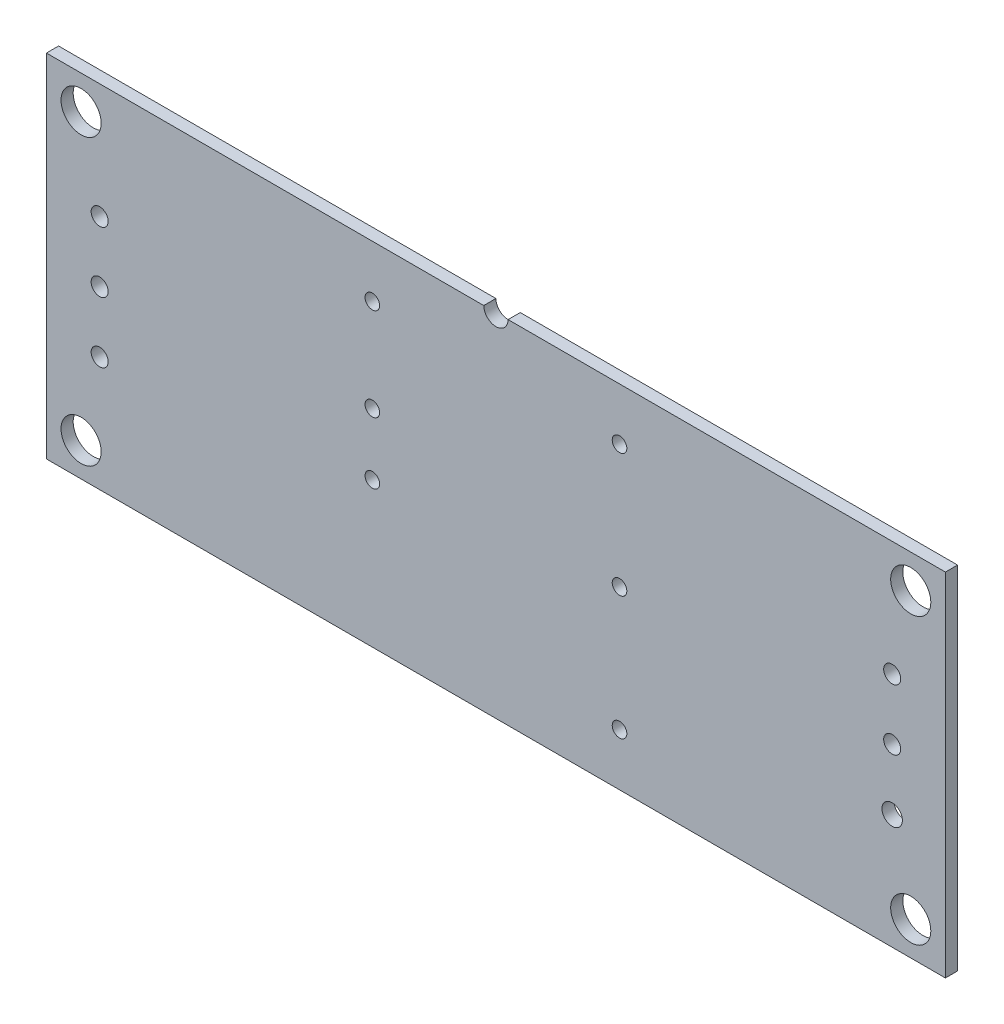
ISO-10303-21;
HEADER;
FILE_DESCRIPTION(('STEP AP214'),'2;1');
FILE_NAME('part.step','',(''),(''),'','','');
FILE_SCHEMA(('AUTOMOTIVE_DESIGN { 1 0 10303 214 1 1 1 1 }'));
ENDSEC;
DATA;
#1=APPLICATION_CONTEXT('core data for automotive mechanical design processes');
#2=APPLICATION_PROTOCOL_DEFINITION('international standard','automotive_design',2000,#1);
#3=PRODUCT_CONTEXT('',#1,'mechanical');
#4=PRODUCT('Part','Part','',(#3));
#5=PRODUCT_RELATED_PRODUCT_CATEGORY('part','',(#4));
#6=PRODUCT_DEFINITION_FORMATION('','',#4);
#7=PRODUCT_DEFINITION_CONTEXT('part definition',#1,'design');
#8=PRODUCT_DEFINITION('design','',#6,#7);
#9=PRODUCT_DEFINITION_SHAPE('','',#8);
#10=(LENGTH_UNIT() NAMED_UNIT(*) SI_UNIT(.MILLI.,.METRE.));
#11=(NAMED_UNIT(*) PLANE_ANGLE_UNIT() SI_UNIT($,.RADIAN.));
#12=(NAMED_UNIT(*) SI_UNIT($,.STERADIAN.) SOLID_ANGLE_UNIT());
#13=UNCERTAINTY_MEASURE_WITH_UNIT(LENGTH_MEASURE(1.E-05),#10,'distance_accuracy_value','');
#14=(GEOMETRIC_REPRESENTATION_CONTEXT(3) GLOBAL_UNCERTAINTY_ASSIGNED_CONTEXT((#13)) GLOBAL_UNIT_ASSIGNED_CONTEXT((#10,
#11,#12)) REPRESENTATION_CONTEXT('',''));
#15=CARTESIAN_POINT('',(0.,0.,0.));
#16=DIRECTION('',(0.,0.,1.));
#17=DIRECTION('',(1.,0.,0.));
#18=AXIS2_PLACEMENT_3D('',#15,#16,#17);
#19=CARTESIAN_POINT('',(0.,0.,0.));
#20=DIRECTION('',(0.,0.,1.));
#21=DIRECTION('',(1.,0.,0.));
#22=AXIS2_PLACEMENT_3D('',#19,#20,#21);
#23=PLANE('',#22);
#24=CARTESIAN_POINT('',(71.05,26.15,0.));
#25=DIRECTION('',(0.,0.,1.));
#26=DIRECTION('',(1.,0.,0.));
#27=AXIS2_PLACEMENT_3D('',#24,#25,#26);
#28=CIRCLE('',#27,1.65);
#29=CARTESIAN_POINT('',(72.7,26.15,0.));
#30=VERTEX_POINT('',#29);
#31=EDGE_CURVE('E173',#30,#30,#28,.T.);
#32=ORIENTED_EDGE('',*,*,#31,.T.);
#33=EDGE_LOOP('',(#32));
#34=FACE_BOUND('',#33,.T.);
#35=CARTESIAN_POINT('',(69.525,19.45,0.));
#36=DIRECTION('',(0.,0.,1.));
#37=DIRECTION('',(1.,0.,0.));
#38=AXIS2_PLACEMENT_3D('',#35,#36,#37);
#39=CIRCLE('',#38,0.699999999999992);
#40=CARTESIAN_POINT('',(70.225,19.45,0.));
#41=VERTEX_POINT('',#40);
#42=EDGE_CURVE('E186',#41,#41,#39,.T.);
#43=ORIENTED_EDGE('',*,*,#42,.T.);
#44=EDGE_LOOP('',(#43));
#45=FACE_BOUND('',#44,.T.);
#46=CARTESIAN_POINT('',(69.525,14.45,0.));
#47=DIRECTION('',(0.,0.,1.));
#48=DIRECTION('',(1.,0.,0.));
#49=AXIS2_PLACEMENT_3D('',#46,#47,#48);
#50=CIRCLE('',#49,0.699999999999992);
#51=CARTESIAN_POINT('',(70.225,14.45,0.));
#52=VERTEX_POINT('',#51);
#53=EDGE_CURVE('E263',#52,#52,#50,.T.);
#54=ORIENTED_EDGE('',*,*,#53,.T.);
#55=EDGE_LOOP('',(#54));
#56=FACE_BOUND('',#55,.T.);
#57=CARTESIAN_POINT('',(69.525,9.45,0.));
#58=DIRECTION('',(0.,0.,1.));
#59=DIRECTION('',(1.,0.,0.));
#60=AXIS2_PLACEMENT_3D('',#57,#58,#59);
#61=CIRCLE('',#60,0.838630455307604);
#62=CARTESIAN_POINT('',(70.3636304553076,9.45,0.));
#63=VERTEX_POINT('',#62);
#64=EDGE_CURVE('E244',#63,#63,#61,.T.);
#65=ORIENTED_EDGE('',*,*,#64,.T.);
#66=EDGE_LOOP('',(#65));
#67=FACE_BOUND('',#66,.T.);
#68=CARTESIAN_POINT('',(71.05,2.75,0.));
#69=DIRECTION('',(0.,0.,1.));
#70=DIRECTION('',(1.,0.,0.));
#71=AXIS2_PLACEMENT_3D('',#68,#69,#70);
#72=CIRCLE('',#71,1.65);
#73=CARTESIAN_POINT('',(72.7,2.75,0.));
#74=VERTEX_POINT('',#73);
#75=EDGE_CURVE('E245',#74,#74,#72,.T.);
#76=ORIENTED_EDGE('',*,*,#75,.T.);
#77=EDGE_LOOP('',(#76));
#78=FACE_BOUND('',#77,.T.);
#79=CARTESIAN_POINT('',(47.111,4.29,0.));
#80=DIRECTION('',(0.,0.,1.));
#81=DIRECTION('',(1.,0.,0.));
#82=AXIS2_PLACEMENT_3D('',#79,#80,#81);
#83=CIRCLE('',#82,0.6);
#84=CARTESIAN_POINT('',(47.711,4.29,0.));
#85=VERTEX_POINT('',#84);
#86=EDGE_CURVE('E190',#85,#85,#83,.T.);
#87=ORIENTED_EDGE('',*,*,#86,.T.);
#88=EDGE_LOOP('',(#87));
#89=FACE_BOUND('',#88,.T.);
#90=CARTESIAN_POINT('',(47.111,14.45,0.));
#91=DIRECTION('',(0.,0.,1.));
#92=DIRECTION('',(1.,0.,0.));
#93=AXIS2_PLACEMENT_3D('',#90,#91,#92);
#94=CIRCLE('',#93,0.6);
#95=CARTESIAN_POINT('',(47.711,14.45,0.));
#96=VERTEX_POINT('',#95);
#97=EDGE_CURVE('E291',#96,#96,#94,.T.);
#98=ORIENTED_EDGE('',*,*,#97,.T.);
#99=EDGE_LOOP('',(#98));
#100=FACE_BOUND('',#99,.T.);
#101=CARTESIAN_POINT('',(47.111,24.61,0.));
#102=DIRECTION('',(0.,0.,1.));
#103=DIRECTION('',(1.,0.,0.));
#104=AXIS2_PLACEMENT_3D('',#101,#102,#103);
#105=CIRCLE('',#104,0.6);
#106=CARTESIAN_POINT('',(47.711,24.61,0.));
#107=VERTEX_POINT('',#106);
#108=EDGE_CURVE('E231',#107,#107,#105,.T.);
#109=ORIENTED_EDGE('',*,*,#108,.T.);
#110=EDGE_LOOP('',(#109));
#111=FACE_BOUND('',#110,.T.);
#112=CARTESIAN_POINT('',(26.791,24.61,0.));
#113=DIRECTION('',(0.,0.,1.));
#114=DIRECTION('',(1.,0.,0.));
#115=AXIS2_PLACEMENT_3D('',#112,#113,#114);
#116=CIRCLE('',#115,0.6);
#117=CARTESIAN_POINT('',(27.391,24.61,0.));
#118=VERTEX_POINT('',#117);
#119=EDGE_CURVE('E232',#118,#118,#116,.T.);
#120=ORIENTED_EDGE('',*,*,#119,.T.);
#121=EDGE_LOOP('',(#120));
#122=FACE_BOUND('',#121,.T.);
#123=CARTESIAN_POINT('',(26.791,16.99,0.));
#124=DIRECTION('',(0.,0.,1.));
#125=DIRECTION('',(1.,0.,0.));
#126=AXIS2_PLACEMENT_3D('',#123,#124,#125);
#127=CIRCLE('',#126,0.6);
#128=CARTESIAN_POINT('',(27.391,16.99,0.));
#129=VERTEX_POINT('',#128);
#130=EDGE_CURVE('E237',#129,#129,#127,.T.);
#131=ORIENTED_EDGE('',*,*,#130,.T.);
#132=EDGE_LOOP('',(#131));
#133=FACE_BOUND('',#132,.T.);
#134=CARTESIAN_POINT('',(26.791,11.91,0.));
#135=DIRECTION('',(0.,0.,1.));
#136=DIRECTION('',(1.,0.,0.));
#137=AXIS2_PLACEMENT_3D('',#134,#135,#136);
#138=CIRCLE('',#137,0.6);
#139=CARTESIAN_POINT('',(27.391,11.91,0.));
#140=VERTEX_POINT('',#139);
#141=EDGE_CURVE('E200',#140,#140,#138,.T.);
#142=ORIENTED_EDGE('',*,*,#141,.T.);
#143=EDGE_LOOP('',(#142));
#144=FACE_BOUND('',#143,.T.);
#145=CARTESIAN_POINT('',(2.85,2.75,0.));
#146=DIRECTION('',(0.,0.,1.));
#147=DIRECTION('',(1.,0.,0.));
#148=AXIS2_PLACEMENT_3D('',#145,#146,#147);
#149=CIRCLE('',#148,1.65);
#150=CARTESIAN_POINT('',(4.5,2.75,0.));
#151=VERTEX_POINT('',#150);
#152=EDGE_CURVE('E201',#151,#151,#149,.T.);
#153=ORIENTED_EDGE('',*,*,#152,.T.);
#154=EDGE_LOOP('',(#153));
#155=FACE_BOUND('',#154,.T.);
#156=CARTESIAN_POINT('',(4.375,9.45,0.));
#157=DIRECTION('',(0.,0.,1.));
#158=DIRECTION('',(1.,0.,0.));
#159=AXIS2_PLACEMENT_3D('',#156,#157,#158);
#160=CIRCLE('',#159,0.7);
#161=CARTESIAN_POINT('',(5.075,9.45,0.));
#162=VERTEX_POINT('',#161);
#163=EDGE_CURVE('E240',#162,#162,#160,.T.);
#164=ORIENTED_EDGE('',*,*,#163,.T.);
#165=EDGE_LOOP('',(#164));
#166=FACE_BOUND('',#165,.T.);
#167=CARTESIAN_POINT('',(4.375,14.45,0.));
#168=DIRECTION('',(0.,0.,1.));
#169=DIRECTION('',(1.,0.,0.));
#170=AXIS2_PLACEMENT_3D('',#167,#168,#169);
#171=CIRCLE('',#170,0.7);
#172=CARTESIAN_POINT('',(5.075,14.45,0.));
#173=VERTEX_POINT('',#172);
#174=EDGE_CURVE('E287',#173,#173,#171,.T.);
#175=ORIENTED_EDGE('',*,*,#174,.T.);
#176=EDGE_LOOP('',(#175));
#177=FACE_BOUND('',#176,.T.);
#178=CARTESIAN_POINT('',(4.375,19.45,0.));
#179=DIRECTION('',(0.,0.,1.));
#180=DIRECTION('',(1.,0.,0.));
#181=AXIS2_PLACEMENT_3D('',#178,#179,#180);
#182=CIRCLE('',#181,0.7);
#183=CARTESIAN_POINT('',(5.075,19.45,0.));
#184=VERTEX_POINT('',#183);
#185=EDGE_CURVE('E208',#184,#184,#182,.T.);
#186=ORIENTED_EDGE('',*,*,#185,.T.);
#187=EDGE_LOOP('',(#186));
#188=FACE_BOUND('',#187,.T.);
#189=CARTESIAN_POINT('',(2.85,26.15,0.));
#190=DIRECTION('',(0.,0.,1.));
#191=DIRECTION('',(1.,0.,0.));
#192=AXIS2_PLACEMENT_3D('',#189,#190,#191);
#193=CIRCLE('',#192,1.65);
#194=CARTESIAN_POINT('',(4.5,26.15,0.));
#195=VERTEX_POINT('',#194);
#196=EDGE_CURVE('E284',#195,#195,#193,.T.);
#197=ORIENTED_EDGE('',*,*,#196,.T.);
#198=EDGE_LOOP('',(#197));
#199=FACE_BOUND('',#198,.T.);
#200=DIRECTION('',(1.,0.,0.));
#201=VECTOR('',#200,1.);
#202=CARTESIAN_POINT('',(73.9,28.9,0.));
#203=LINE('',#202,#201);
#204=CARTESIAN_POINT('',(37.95,28.9,0.));
#205=VERTEX_POINT('',#204);
#206=CARTESIAN_POINT('',(73.9,28.9,0.));
#207=VERTEX_POINT('',#206);
#208=EDGE_CURVE('E11',#205,#207,#203,.T.);
#209=ORIENTED_EDGE('',*,*,#208,.T.);
#210=DIRECTION('',(0.,-1.,0.));
#211=VECTOR('',#210,1.);
#212=CARTESIAN_POINT('',(73.9,0.,0.));
#213=LINE('',#212,#211);
#214=CARTESIAN_POINT('',(73.9,0.,0.));
#215=VERTEX_POINT('',#214);
#216=EDGE_CURVE('E202',#207,#215,#213,.T.);
#217=ORIENTED_EDGE('',*,*,#216,.T.);
#218=DIRECTION('',(-1.,0.,0.));
#219=VECTOR('',#218,1.);
#220=CARTESIAN_POINT('',(0.,0.,0.));
#221=LINE('',#220,#219);
#222=CARTESIAN_POINT('',(0.,0.,0.));
#223=VERTEX_POINT('',#222);
#224=EDGE_CURVE('E214',#215,#223,#221,.T.);
#225=ORIENTED_EDGE('',*,*,#224,.T.);
#226=DIRECTION('',(0.,1.,0.));
#227=VECTOR('',#226,1.);
#228=CARTESIAN_POINT('',(0.,28.9,0.));
#229=LINE('',#228,#227);
#230=CARTESIAN_POINT('',(0.,28.9,0.));
#231=VERTEX_POINT('',#230);
#232=EDGE_CURVE('E248',#223,#231,#229,.T.);
#233=ORIENTED_EDGE('',*,*,#232,.T.);
#234=DIRECTION('',(1.,0.,0.));
#235=VECTOR('',#234,1.);
#236=CARTESIAN_POINT('',(73.9,28.9,0.));
#237=LINE('',#236,#235);
#238=CARTESIAN_POINT('',(35.95,28.9,0.));
#239=VERTEX_POINT('',#238);
#240=EDGE_CURVE('E271',#231,#239,#237,.T.);
#241=ORIENTED_EDGE('',*,*,#240,.T.);
#242=CARTESIAN_POINT('',(36.95,28.9,0.));
#243=DIRECTION('',(0.,0.,1.));
#244=DIRECTION('',(1.,0.,0.));
#245=AXIS2_PLACEMENT_3D('',#242,#243,#244);
#246=CIRCLE('',#245,1.);
#247=EDGE_CURVE('E221',#239,#205,#246,.T.);
#248=ORIENTED_EDGE('',*,*,#247,.T.);
#249=EDGE_LOOP('',(#209,#217,#225,#233,#241,#248));
#250=FACE_BOUND('',#249,.T.);
#251=ADVANCED_FACE('F18',(#34,#45,#56,#67,#78,#89,#100,#111,#122,#133,#144,#155,#166,#177,#188,
#199,#250),#23,.F.);
#252=CARTESIAN_POINT('',(73.9,28.9,1.));
#253=DIRECTION('',(0.,-1.,0.));
#254=DIRECTION('',(0.,0.,-1.));
#255=AXIS2_PLACEMENT_3D('',#252,#253,#254);
#256=PLANE('',#255);
#257=DIRECTION('',(-1.,0.,0.));
#258=VECTOR('',#257,1.);
#259=CARTESIAN_POINT('',(0.,28.9,1.));
#260=LINE('',#259,#258);
#261=CARTESIAN_POINT('',(73.9,28.9,1.));
#262=VERTEX_POINT('',#261);
#263=CARTESIAN_POINT('',(37.95,28.9,1.));
#264=VERTEX_POINT('',#263);
#265=EDGE_CURVE('E191',#262,#264,#260,.T.);
#266=ORIENTED_EDGE('',*,*,#265,.F.);
#267=DIRECTION('',(0.,0.,-1.));
#268=VECTOR('',#267,1.);
#269=CARTESIAN_POINT('',(73.9,28.9,1.));
#270=LINE('',#269,#268);
#271=EDGE_CURVE('E266',#262,#207,#270,.T.);
#272=ORIENTED_EDGE('',*,*,#271,.T.);
#273=ORIENTED_EDGE('',*,*,#208,.F.);
#274=DIRECTION('',(0.,0.,1.));
#275=VECTOR('',#274,1.);
#276=CARTESIAN_POINT('',(37.95,28.9,-78.7259054511142));
#277=LINE('',#276,#275);
#278=EDGE_CURVE('E28',#205,#264,#277,.T.);
#279=ORIENTED_EDGE('',*,*,#278,.T.);
#280=EDGE_LOOP('',(#266,#272,#273,#279));
#281=FACE_BOUND('',#280,.T.);
#282=ADVANCED_FACE('F363',(#281),#256,.F.);
#283=CARTESIAN_POINT('',(36.95,28.9,-78.7259054511142));
#284=DIRECTION('',(0.,0.,1.));
#285=DIRECTION('',(1.,0.,0.));
#286=AXIS2_PLACEMENT_3D('',#283,#284,#285);
#287=CYLINDRICAL_SURFACE('',#286,1.);
#288=ORIENTED_EDGE('',*,*,#247,.F.);
#289=DIRECTION('',(0.,0.,1.));
#290=VECTOR('',#289,1.);
#291=CARTESIAN_POINT('',(35.95,28.9,1.));
#292=LINE('',#291,#290);
#293=CARTESIAN_POINT('',(35.95,28.9,1.));
#294=VERTEX_POINT('',#293);
#295=EDGE_CURVE('E267',#239,#294,#292,.T.);
#296=ORIENTED_EDGE('',*,*,#295,.T.);
#297=CARTESIAN_POINT('',(36.95,28.9,1.));
#298=DIRECTION('',(0.,0.,-1.));
#299=DIRECTION('',(1.,0.,0.));
#300=AXIS2_PLACEMENT_3D('',#297,#298,#299);
#301=CIRCLE('',#300,1.);
#302=EDGE_CURVE('E195',#264,#294,#301,.T.);
#303=ORIENTED_EDGE('',*,*,#302,.F.);
#304=ORIENTED_EDGE('',*,*,#278,.F.);
#305=EDGE_LOOP('',(#288,#296,#303,#304));
#306=FACE_BOUND('',#305,.T.);
#307=ADVANCED_FACE('F403',(#306),#287,.F.);
#308=CARTESIAN_POINT('',(73.9,28.9,1.));
#309=DIRECTION('',(0.,-1.,0.));
#310=DIRECTION('',(0.,0.,-1.));
#311=AXIS2_PLACEMENT_3D('',#308,#309,#310);
#312=PLANE('',#311);
#313=ORIENTED_EDGE('',*,*,#240,.F.);
#314=DIRECTION('',(0.,0.,1.));
#315=VECTOR('',#314,1.);
#316=CARTESIAN_POINT('',(0.,28.9,1.));
#317=LINE('',#316,#315);
#318=CARTESIAN_POINT('',(0.,28.9,1.));
#319=VERTEX_POINT('',#318);
#320=EDGE_CURVE('E218',#231,#319,#317,.T.);
#321=ORIENTED_EDGE('',*,*,#320,.T.);
#322=DIRECTION('',(-1.,0.,0.));
#323=VECTOR('',#322,1.);
#324=CARTESIAN_POINT('',(0.,28.9,1.));
#325=LINE('',#324,#323);
#326=EDGE_CURVE('E249',#294,#319,#325,.T.);
#327=ORIENTED_EDGE('',*,*,#326,.F.);
#328=ORIENTED_EDGE('',*,*,#295,.F.);
#329=EDGE_LOOP('',(#313,#321,#327,#328));
#330=FACE_BOUND('',#329,.T.);
#331=ADVANCED_FACE('F400',(#330),#312,.F.);
#332=CARTESIAN_POINT('',(0.,28.9,1.));
#333=DIRECTION('',(1.,0.,0.));
#334=DIRECTION('',(0.,1.,0.));
#335=AXIS2_PLACEMENT_3D('',#332,#333,#334);
#336=PLANE('',#335);
#337=DIRECTION('',(0.,0.,1.));
#338=VECTOR('',#337,1.);
#339=CARTESIAN_POINT('',(0.,0.,1.));
#340=LINE('',#339,#338);
#341=CARTESIAN_POINT('',(0.,0.,1.));
#342=VERTEX_POINT('',#341);
#343=EDGE_CURVE('E206',#223,#342,#340,.T.);
#344=ORIENTED_EDGE('',*,*,#343,.T.);
#345=DIRECTION('',(0.,-1.,0.));
#346=VECTOR('',#345,1.);
#347=CARTESIAN_POINT('',(0.,0.,1.));
#348=LINE('',#347,#346);
#349=EDGE_CURVE('E253',#319,#342,#348,.T.);
#350=ORIENTED_EDGE('',*,*,#349,.F.);
#351=ORIENTED_EDGE('',*,*,#320,.F.);
#352=ORIENTED_EDGE('',*,*,#232,.F.);
#353=EDGE_LOOP('',(#344,#350,#351,#352));
#354=FACE_BOUND('',#353,.T.);
#355=ADVANCED_FACE('F397',(#354),#336,.F.);
#356=CARTESIAN_POINT('',(0.,0.,1.));
#357=DIRECTION('',(0.,1.,0.));
#358=DIRECTION('',(1.,0.,0.));
#359=AXIS2_PLACEMENT_3D('',#356,#357,#358);
#360=PLANE('',#359);
#361=DIRECTION('',(0.,0.,1.));
#362=VECTOR('',#361,1.);
#363=CARTESIAN_POINT('',(73.9,0.,1.));
#364=LINE('',#363,#362);
#365=CARTESIAN_POINT('',(73.9,0.,1.));
#366=VERTEX_POINT('',#365);
#367=EDGE_CURVE('E207',#215,#366,#364,.T.);
#368=ORIENTED_EDGE('',*,*,#367,.T.);
#369=DIRECTION('',(1.,0.,0.));
#370=VECTOR('',#369,1.);
#371=CARTESIAN_POINT('',(0.,0.,1.));
#372=LINE('',#371,#370);
#373=EDGE_CURVE('E184',#342,#366,#372,.T.);
#374=ORIENTED_EDGE('',*,*,#373,.F.);
#375=ORIENTED_EDGE('',*,*,#343,.F.);
#376=ORIENTED_EDGE('',*,*,#224,.F.);
#377=EDGE_LOOP('',(#368,#374,#375,#376));
#378=FACE_BOUND('',#377,.T.);
#379=ADVANCED_FACE('F390',(#378),#360,.F.);
#380=CARTESIAN_POINT('',(73.9,0.,1.));
#381=DIRECTION('',(-1.,0.,0.));
#382=DIRECTION('',(0.,0.,1.));
#383=AXIS2_PLACEMENT_3D('',#380,#381,#382);
#384=PLANE('',#383);
#385=ORIENTED_EDGE('',*,*,#271,.F.);
#386=DIRECTION('',(0.,1.,0.));
#387=VECTOR('',#386,1.);
#388=CARTESIAN_POINT('',(73.9,0.,1.));
#389=LINE('',#388,#387);
#390=EDGE_CURVE('E196',#366,#262,#389,.T.);
#391=ORIENTED_EDGE('',*,*,#390,.F.);
#392=ORIENTED_EDGE('',*,*,#367,.F.);
#393=ORIENTED_EDGE('',*,*,#216,.F.);
#394=EDGE_LOOP('',(#385,#391,#392,#393));
#395=FACE_BOUND('',#394,.T.);
#396=ADVANCED_FACE('F380',(#395),#384,.F.);
#397=CARTESIAN_POINT('',(0.,0.,1.));
#398=DIRECTION('',(0.,0.,1.));
#399=DIRECTION('',(1.,0.,0.));
#400=AXIS2_PLACEMENT_3D('',#397,#398,#399);
#401=PLANE('',#400);
#402=CARTESIAN_POINT('',(71.05,26.15,1.));
#403=DIRECTION('',(0.,0.,-1.));
#404=DIRECTION('',(1.,0.,0.));
#405=AXIS2_PLACEMENT_3D('',#402,#403,#404);
#406=CIRCLE('',#405,1.65);
#407=CARTESIAN_POINT('',(72.7,26.15,1.));
#408=VERTEX_POINT('',#407);
#409=EDGE_CURVE('E177',#408,#408,#406,.T.);
#410=ORIENTED_EDGE('',*,*,#409,.T.);
#411=EDGE_LOOP('',(#410));
#412=FACE_BOUND('',#411,.T.);
#413=CARTESIAN_POINT('',(69.525,19.45,1.));
#414=DIRECTION('',(0.,0.,-1.));
#415=DIRECTION('',(1.,0.,0.));
#416=AXIS2_PLACEMENT_3D('',#413,#414,#415);
#417=CIRCLE('',#416,0.699999999999992);
#418=CARTESIAN_POINT('',(70.225,19.45,1.));
#419=VERTEX_POINT('',#418);
#420=EDGE_CURVE('E178',#419,#419,#417,.T.);
#421=ORIENTED_EDGE('',*,*,#420,.T.);
#422=EDGE_LOOP('',(#421));
#423=FACE_BOUND('',#422,.T.);
#424=CARTESIAN_POINT('',(69.525,14.45,1.));
#425=DIRECTION('',(0.,0.,-1.));
#426=DIRECTION('',(1.,0.,0.));
#427=AXIS2_PLACEMENT_3D('',#424,#425,#426);
#428=CIRCLE('',#427,0.699999999999992);
#429=CARTESIAN_POINT('',(70.225,14.45,1.));
#430=VERTEX_POINT('',#429);
#431=EDGE_CURVE('E226',#430,#430,#428,.T.);
#432=ORIENTED_EDGE('',*,*,#431,.T.);
#433=EDGE_LOOP('',(#432));
#434=FACE_BOUND('',#433,.T.);
#435=CARTESIAN_POINT('',(69.525,9.45,1.));
#436=DIRECTION('',(0.,0.,-1.));
#437=DIRECTION('',(1.,0.,0.));
#438=AXIS2_PLACEMENT_3D('',#435,#436,#437);
#439=CIRCLE('',#438,0.838630455307604);
#440=CARTESIAN_POINT('',(70.3636304553076,9.45,1.));
#441=VERTEX_POINT('',#440);
#442=EDGE_CURVE('E260',#441,#441,#439,.T.);
#443=ORIENTED_EDGE('',*,*,#442,.T.);
#444=EDGE_LOOP('',(#443));
#445=FACE_BOUND('',#444,.T.);
#446=CARTESIAN_POINT('',(71.05,2.75,1.));
#447=DIRECTION('',(0.,0.,-1.));
#448=DIRECTION('',(1.,0.,0.));
#449=AXIS2_PLACEMENT_3D('',#446,#447,#448);
#450=CIRCLE('',#449,1.65);
#451=CARTESIAN_POINT('',(72.7,2.75,1.));
#452=VERTEX_POINT('',#451);
#453=EDGE_CURVE('E241',#452,#452,#450,.T.);
#454=ORIENTED_EDGE('',*,*,#453,.T.);
#455=EDGE_LOOP('',(#454));
#456=FACE_BOUND('',#455,.T.);
#457=CARTESIAN_POINT('',(47.111,4.29,1.));
#458=DIRECTION('',(0.,0.,-1.));
#459=DIRECTION('',(1.,0.,0.));
#460=AXIS2_PLACEMENT_3D('',#457,#458,#459);
#461=CIRCLE('',#460,0.6);
#462=CARTESIAN_POINT('',(47.711,4.29,1.));
#463=VERTEX_POINT('',#462);
#464=EDGE_CURVE('E298',#463,#463,#461,.T.);
#465=ORIENTED_EDGE('',*,*,#464,.T.);
#466=EDGE_LOOP('',(#465));
#467=FACE_BOUND('',#466,.T.);
#468=CARTESIAN_POINT('',(47.111,14.45,1.));
#469=DIRECTION('',(0.,0.,-1.));
#470=DIRECTION('',(1.,0.,0.));
#471=AXIS2_PLACEMENT_3D('',#468,#469,#470);
#472=CIRCLE('',#471,0.6);
#473=CARTESIAN_POINT('',(47.711,14.45,1.));
#474=VERTEX_POINT('',#473);
#475=EDGE_CURVE('E295',#474,#474,#472,.T.);
#476=ORIENTED_EDGE('',*,*,#475,.T.);
#477=EDGE_LOOP('',(#476));
#478=FACE_BOUND('',#477,.T.);
#479=CARTESIAN_POINT('',(47.111,24.61,1.));
#480=DIRECTION('',(0.,0.,-1.));
#481=DIRECTION('',(1.,0.,0.));
#482=AXIS2_PLACEMENT_3D('',#479,#480,#481);
#483=CIRCLE('',#482,0.6);
#484=CARTESIAN_POINT('',(47.711,24.61,1.));
#485=VERTEX_POINT('',#484);
#486=EDGE_CURVE('E276',#485,#485,#483,.T.);
#487=ORIENTED_EDGE('',*,*,#486,.T.);
#488=EDGE_LOOP('',(#487));
#489=FACE_BOUND('',#488,.T.);
#490=CARTESIAN_POINT('',(26.791,24.61,1.));
#491=DIRECTION('',(0.,0.,-1.));
#492=DIRECTION('',(1.,0.,0.));
#493=AXIS2_PLACEMENT_3D('',#490,#491,#492);
#494=CIRCLE('',#493,0.6);
#495=CARTESIAN_POINT('',(27.391,24.61,1.));
#496=VERTEX_POINT('',#495);
#497=EDGE_CURVE('E228',#496,#496,#494,.T.);
#498=ORIENTED_EDGE('',*,*,#497,.T.);
#499=EDGE_LOOP('',(#498));
#500=FACE_BOUND('',#499,.T.);
#501=CARTESIAN_POINT('',(26.791,16.99,1.));
#502=DIRECTION('',(0.,0.,-1.));
#503=DIRECTION('',(1.,0.,0.));
#504=AXIS2_PLACEMENT_3D('',#501,#502,#503);
#505=CIRCLE('',#504,0.6);
#506=CARTESIAN_POINT('',(27.391,16.99,1.));
#507=VERTEX_POINT('',#506);
#508=EDGE_CURVE('E21',#507,#507,#505,.T.);
#509=ORIENTED_EDGE('',*,*,#508,.T.);
#510=EDGE_LOOP('',(#509));
#511=FACE_BOUND('',#510,.T.);
#512=CARTESIAN_POINT('',(26.791,11.91,1.));
#513=DIRECTION('',(0.,0.,-1.));
#514=DIRECTION('',(1.,0.,0.));
#515=AXIS2_PLACEMENT_3D('',#512,#513,#514);
#516=CIRCLE('',#515,0.6);
#517=CARTESIAN_POINT('',(27.391,11.91,1.));
#518=VERTEX_POINT('',#517);
#519=EDGE_CURVE('E233',#518,#518,#516,.T.);
#520=ORIENTED_EDGE('',*,*,#519,.T.);
#521=EDGE_LOOP('',(#520));
#522=FACE_BOUND('',#521,.T.);
#523=CARTESIAN_POINT('',(2.85,2.75,1.));
#524=DIRECTION('',(0.,0.,-1.));
#525=DIRECTION('',(1.,0.,0.));
#526=AXIS2_PLACEMENT_3D('',#523,#524,#525);
#527=CIRCLE('',#526,1.65);
#528=CARTESIAN_POINT('',(4.5,2.75,1.));
#529=VERTEX_POINT('',#528);
#530=EDGE_CURVE('E197',#529,#529,#527,.T.);
#531=ORIENTED_EDGE('',*,*,#530,.T.);
#532=EDGE_LOOP('',(#531));
#533=FACE_BOUND('',#532,.T.);
#534=CARTESIAN_POINT('',(4.375,9.45,1.));
#535=DIRECTION('',(0.,0.,-1.));
#536=DIRECTION('',(1.,0.,0.));
#537=AXIS2_PLACEMENT_3D('',#534,#535,#536);
#538=CIRCLE('',#537,0.7);
#539=CARTESIAN_POINT('',(5.075,9.45,1.));
#540=VERTEX_POINT('',#539);
#541=EDGE_CURVE('E224',#540,#540,#538,.T.);
#542=ORIENTED_EDGE('',*,*,#541,.T.);
#543=EDGE_LOOP('',(#542));
#544=FACE_BOUND('',#543,.T.);
#545=CARTESIAN_POINT('',(4.375,14.45,1.));
#546=DIRECTION('',(0.,0.,-1.));
#547=DIRECTION('',(1.,0.,0.));
#548=AXIS2_PLACEMENT_3D('',#545,#546,#547);
#549=CIRCLE('',#548,0.7);
#550=CARTESIAN_POINT('',(5.075,14.45,1.));
#551=VERTEX_POINT('',#550);
#552=EDGE_CURVE('E305',#551,#551,#549,.T.);
#553=ORIENTED_EDGE('',*,*,#552,.T.);
#554=EDGE_LOOP('',(#553));
#555=FACE_BOUND('',#554,.T.);
#556=CARTESIAN_POINT('',(4.375,19.45,1.));
#557=DIRECTION('',(0.,0.,-1.));
#558=DIRECTION('',(1.,0.,0.));
#559=AXIS2_PLACEMENT_3D('',#556,#557,#558);
#560=CIRCLE('',#559,0.7);
#561=CARTESIAN_POINT('',(5.075,19.45,1.));
#562=VERTEX_POINT('',#561);
#563=EDGE_CURVE('E212',#562,#562,#560,.T.);
#564=ORIENTED_EDGE('',*,*,#563,.T.);
#565=EDGE_LOOP('',(#564));
#566=FACE_BOUND('',#565,.T.);
#567=CARTESIAN_POINT('',(2.85,26.15,1.));
#568=DIRECTION('',(0.,0.,-1.));
#569=DIRECTION('',(1.,0.,0.));
#570=AXIS2_PLACEMENT_3D('',#567,#568,#569);
#571=CIRCLE('',#570,1.65);
#572=CARTESIAN_POINT('',(4.5,26.15,1.));
#573=VERTEX_POINT('',#572);
#574=EDGE_CURVE('E213',#573,#573,#571,.T.);
#575=ORIENTED_EDGE('',*,*,#574,.T.);
#576=EDGE_LOOP('',(#575));
#577=FACE_BOUND('',#576,.T.);
#578=ORIENTED_EDGE('',*,*,#373,.T.);
#579=ORIENTED_EDGE('',*,*,#390,.T.);
#580=ORIENTED_EDGE('',*,*,#265,.T.);
#581=ORIENTED_EDGE('',*,*,#302,.T.);
#582=ORIENTED_EDGE('',*,*,#326,.T.);
#583=ORIENTED_EDGE('',*,*,#349,.T.);
#584=EDGE_LOOP('',(#578,#579,#580,#581,#582,#583));
#585=FACE_BOUND('',#584,.T.);
#586=ADVANCED_FACE('F347',(#412,#423,#434,#445,#456,#467,#478,#489,#500,#511,#522,#533,#544,
#555,#566,#577,#585),#401,.T.);
#587=CARTESIAN_POINT('',(71.05,26.15,-78.3562851953139));
#588=DIRECTION('',(0.,0.,1.));
#589=DIRECTION('',(1.,0.,0.));
#590=AXIS2_PLACEMENT_3D('',#587,#588,#589);
#591=CYLINDRICAL_SURFACE('',#590,1.65);
#592=ORIENTED_EDGE('',*,*,#409,.F.);
#593=EDGE_LOOP('',(#592));
#594=FACE_BOUND('',#593,.T.);
#595=ORIENTED_EDGE('',*,*,#31,.F.);
#596=EDGE_LOOP('',(#595));
#597=FACE_BOUND('',#596,.T.);
#598=ADVANCED_FACE('F469',(#594,#597),#591,.F.);
#599=CARTESIAN_POINT('',(69.525,19.45,-78.3562851953139));
#600=DIRECTION('',(0.,0.,1.));
#601=DIRECTION('',(1.,0.,0.));
#602=AXIS2_PLACEMENT_3D('',#599,#600,#601);
#603=CYLINDRICAL_SURFACE('',#602,0.699999999999992);
#604=ORIENTED_EDGE('',*,*,#420,.F.);
#605=EDGE_LOOP('',(#604));
#606=FACE_BOUND('',#605,.T.);
#607=ORIENTED_EDGE('',*,*,#42,.F.);
#608=EDGE_LOOP('',(#607));
#609=FACE_BOUND('',#608,.T.);
#610=ADVANCED_FACE('F459',(#606,#609),#603,.F.);
#611=CARTESIAN_POINT('',(69.525,14.45,-78.3562851953139));
#612=DIRECTION('',(0.,0.,1.));
#613=DIRECTION('',(1.,0.,0.));
#614=AXIS2_PLACEMENT_3D('',#611,#612,#613);
#615=CYLINDRICAL_SURFACE('',#614,0.699999999999992);
#616=ORIENTED_EDGE('',*,*,#431,.F.);
#617=EDGE_LOOP('',(#616));
#618=FACE_BOUND('',#617,.T.);
#619=ORIENTED_EDGE('',*,*,#53,.F.);
#620=EDGE_LOOP('',(#619));
#621=FACE_BOUND('',#620,.T.);
#622=ADVANCED_FACE('F455',(#618,#621),#615,.F.);
#623=CARTESIAN_POINT('',(69.525,9.45,-78.3562851953139));
#624=DIRECTION('',(0.,0.,1.));
#625=DIRECTION('',(1.,0.,0.));
#626=AXIS2_PLACEMENT_3D('',#623,#624,#625);
#627=CYLINDRICAL_SURFACE('',#626,0.838630455307604);
#628=ORIENTED_EDGE('',*,*,#442,.F.);
#629=EDGE_LOOP('',(#628));
#630=FACE_BOUND('',#629,.T.);
#631=ORIENTED_EDGE('',*,*,#64,.F.);
#632=EDGE_LOOP('',(#631));
#633=FACE_BOUND('',#632,.T.);
#634=ADVANCED_FACE('F458',(#630,#633),#627,.F.);
#635=CARTESIAN_POINT('',(71.05,2.75,-78.3562851953139));
#636=DIRECTION('',(0.,0.,1.));
#637=DIRECTION('',(1.,0.,0.));
#638=AXIS2_PLACEMENT_3D('',#635,#636,#637);
#639=CYLINDRICAL_SURFACE('',#638,1.65);
#640=ORIENTED_EDGE('',*,*,#453,.F.);
#641=EDGE_LOOP('',(#640));
#642=FACE_BOUND('',#641,.T.);
#643=ORIENTED_EDGE('',*,*,#75,.F.);
#644=EDGE_LOOP('',(#643));
#645=FACE_BOUND('',#644,.T.);
#646=ADVANCED_FACE('F476',(#642,#645),#639,.F.);
#647=CARTESIAN_POINT('',(47.111,4.29,-78.3562851953139));
#648=DIRECTION('',(0.,0.,1.));
#649=DIRECTION('',(1.,0.,0.));
#650=AXIS2_PLACEMENT_3D('',#647,#648,#649);
#651=CYLINDRICAL_SURFACE('',#650,0.6);
#652=ORIENTED_EDGE('',*,*,#464,.F.);
#653=EDGE_LOOP('',(#652));
#654=FACE_BOUND('',#653,.T.);
#655=ORIENTED_EDGE('',*,*,#86,.F.);
#656=EDGE_LOOP('',(#655));
#657=FACE_BOUND('',#656,.T.);
#658=ADVANCED_FACE('F465',(#654,#657),#651,.F.);
#659=CARTESIAN_POINT('',(47.111,14.45,-78.3562851953139));
#660=DIRECTION('',(0.,0.,1.));
#661=DIRECTION('',(1.,0.,0.));
#662=AXIS2_PLACEMENT_3D('',#659,#660,#661);
#663=CYLINDRICAL_SURFACE('',#662,0.6);
#664=ORIENTED_EDGE('',*,*,#475,.F.);
#665=EDGE_LOOP('',(#664));
#666=FACE_BOUND('',#665,.T.);
#667=ORIENTED_EDGE('',*,*,#97,.F.);
#668=EDGE_LOOP('',(#667));
#669=FACE_BOUND('',#668,.T.);
#670=ADVANCED_FACE('F461',(#666,#669),#663,.F.);
#671=CARTESIAN_POINT('',(47.111,24.61,-78.3562851953139));
#672=DIRECTION('',(0.,0.,1.));
#673=DIRECTION('',(1.,0.,0.));
#674=AXIS2_PLACEMENT_3D('',#671,#672,#673);
#675=CYLINDRICAL_SURFACE('',#674,0.6);
#676=ORIENTED_EDGE('',*,*,#486,.F.);
#677=EDGE_LOOP('',(#676));
#678=FACE_BOUND('',#677,.T.);
#679=ORIENTED_EDGE('',*,*,#108,.F.);
#680=EDGE_LOOP('',(#679));
#681=FACE_BOUND('',#680,.T.);
#682=ADVANCED_FACE('F464',(#678,#681),#675,.F.);
#683=CARTESIAN_POINT('',(26.791,24.61,-78.3562851953139));
#684=DIRECTION('',(0.,0.,1.));
#685=DIRECTION('',(1.,0.,0.));
#686=AXIS2_PLACEMENT_3D('',#683,#684,#685);
#687=CYLINDRICAL_SURFACE('',#686,0.6);
#688=ORIENTED_EDGE('',*,*,#497,.F.);
#689=EDGE_LOOP('',(#688));
#690=FACE_BOUND('',#689,.T.);
#691=ORIENTED_EDGE('',*,*,#119,.F.);
#692=EDGE_LOOP('',(#691));
#693=FACE_BOUND('',#692,.T.);
#694=ADVANCED_FACE('F354',(#690,#693),#687,.F.);
#695=CARTESIAN_POINT('',(26.791,16.99,-78.3562851953139));
#696=DIRECTION('',(0.,0.,1.));
#697=DIRECTION('',(1.,0.,0.));
#698=AXIS2_PLACEMENT_3D('',#695,#696,#697);
#699=CYLINDRICAL_SURFACE('',#698,0.6);
#700=ORIENTED_EDGE('',*,*,#508,.F.);
#701=EDGE_LOOP('',(#700));
#702=FACE_BOUND('',#701,.T.);
#703=ORIENTED_EDGE('',*,*,#130,.F.);
#704=EDGE_LOOP('',(#703));
#705=FACE_BOUND('',#704,.T.);
#706=ADVANCED_FACE('F350',(#702,#705),#699,.F.);
#707=CARTESIAN_POINT('',(26.791,11.91,-78.3562851953139));
#708=DIRECTION('',(0.,0.,1.));
#709=DIRECTION('',(1.,0.,0.));
#710=AXIS2_PLACEMENT_3D('',#707,#708,#709);
#711=CYLINDRICAL_SURFACE('',#710,0.6);
#712=ORIENTED_EDGE('',*,*,#519,.F.);
#713=EDGE_LOOP('',(#712));
#714=FACE_BOUND('',#713,.T.);
#715=ORIENTED_EDGE('',*,*,#141,.F.);
#716=EDGE_LOOP('',(#715));
#717=FACE_BOUND('',#716,.T.);
#718=ADVANCED_FACE('F353',(#714,#717),#711,.F.);
#719=CARTESIAN_POINT('',(2.85,2.75,-78.3562851953139));
#720=DIRECTION('',(0.,0.,1.));
#721=DIRECTION('',(1.,0.,0.));
#722=AXIS2_PLACEMENT_3D('',#719,#720,#721);
#723=CYLINDRICAL_SURFACE('',#722,1.65);
#724=ORIENTED_EDGE('',*,*,#530,.F.);
#725=EDGE_LOOP('',(#724));
#726=FACE_BOUND('',#725,.T.);
#727=ORIENTED_EDGE('',*,*,#152,.F.);
#728=EDGE_LOOP('',(#727));
#729=FACE_BOUND('',#728,.T.);
#730=ADVANCED_FACE('F445',(#726,#729),#723,.F.);
#731=CARTESIAN_POINT('',(4.375,9.45,-78.3562851953139));
#732=DIRECTION('',(0.,0.,1.));
#733=DIRECTION('',(1.,0.,0.));
#734=AXIS2_PLACEMENT_3D('',#731,#732,#733);
#735=CYLINDRICAL_SURFACE('',#734,0.7);
#736=ORIENTED_EDGE('',*,*,#541,.F.);
#737=EDGE_LOOP('',(#736));
#738=FACE_BOUND('',#737,.T.);
#739=ORIENTED_EDGE('',*,*,#163,.F.);
#740=EDGE_LOOP('',(#739));
#741=FACE_BOUND('',#740,.T.);
#742=ADVANCED_FACE('F435',(#738,#741),#735,.F.);
#743=CARTESIAN_POINT('',(4.375,14.45,-78.3562851953139));
#744=DIRECTION('',(0.,0.,1.));
#745=DIRECTION('',(1.,0.,0.));
#746=AXIS2_PLACEMENT_3D('',#743,#744,#745);
#747=CYLINDRICAL_SURFACE('',#746,0.7);
#748=ORIENTED_EDGE('',*,*,#552,.F.);
#749=EDGE_LOOP('',(#748));
#750=FACE_BOUND('',#749,.T.);
#751=ORIENTED_EDGE('',*,*,#174,.F.);
#752=EDGE_LOOP('',(#751));
#753=FACE_BOUND('',#752,.T.);
#754=ADVANCED_FACE('F431',(#750,#753),#747,.F.);
#755=CARTESIAN_POINT('',(4.375,19.45,-78.3562851953139));
#756=DIRECTION('',(0.,0.,1.));
#757=DIRECTION('',(1.,0.,0.));
#758=AXIS2_PLACEMENT_3D('',#755,#756,#757);
#759=CYLINDRICAL_SURFACE('',#758,0.7);
#760=ORIENTED_EDGE('',*,*,#563,.F.);
#761=EDGE_LOOP('',(#760));
#762=FACE_BOUND('',#761,.T.);
#763=ORIENTED_EDGE('',*,*,#185,.F.);
#764=EDGE_LOOP('',(#763));
#765=FACE_BOUND('',#764,.T.);
#766=ADVANCED_FACE('F434',(#762,#765),#759,.F.);
#767=CARTESIAN_POINT('',(2.85,26.15,-78.3562851953139));
#768=DIRECTION('',(0.,0.,1.));
#769=DIRECTION('',(1.,0.,0.));
#770=AXIS2_PLACEMENT_3D('',#767,#768,#769);
#771=CYLINDRICAL_SURFACE('',#770,1.65);
#772=ORIENTED_EDGE('',*,*,#574,.F.);
#773=EDGE_LOOP('',(#772));
#774=FACE_BOUND('',#773,.T.);
#775=ORIENTED_EDGE('',*,*,#196,.F.);
#776=EDGE_LOOP('',(#775));
#777=FACE_BOUND('',#776,.T.);
#778=ADVANCED_FACE('F442',(#774,#777),#771,.F.);
#779=CLOSED_SHELL('',(#251,#282,#307,#331,#355,#379,#396,#586,#598,#610,#622,#634,#646,#658,
#670,#682,#694,#706,#718,#730,#742,#754,#766,#778));
#780=MANIFOLD_SOLID_BREP('B1',#779);
#781=ADVANCED_BREP_SHAPE_REPRESENTATION('',(#18,#780),#14);
#782=SHAPE_DEFINITION_REPRESENTATION(#9,#781);
ENDSEC;
END-ISO-10303-21;
